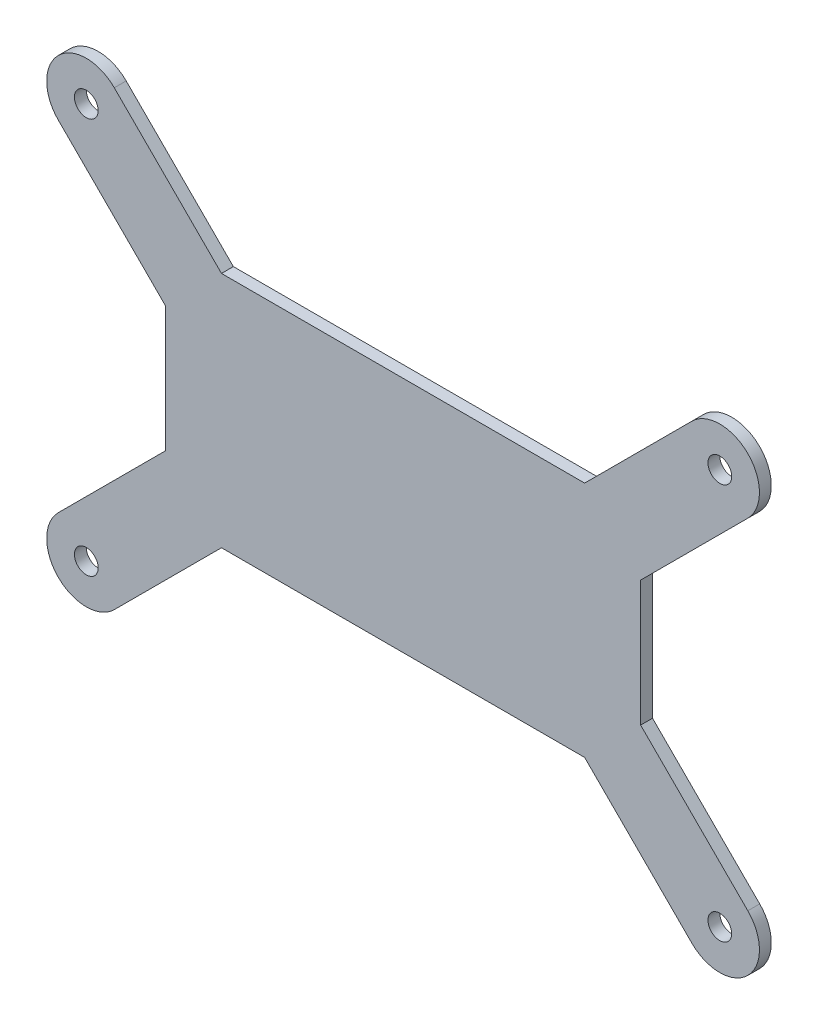
ISO-10303-21;
HEADER;
FILE_DESCRIPTION(('STEP AP214'),'2;1');
FILE_NAME('part.step','',(''),(''),'','','');
FILE_SCHEMA(('AUTOMOTIVE_DESIGN { 1 0 10303 214 1 1 1 1 }'));
ENDSEC;
DATA;
#1=APPLICATION_CONTEXT('core data for automotive mechanical design processes');
#2=APPLICATION_PROTOCOL_DEFINITION('international standard','automotive_design',2000,#1);
#3=PRODUCT_CONTEXT('',#1,'mechanical');
#4=PRODUCT('Part','Part','',(#3));
#5=PRODUCT_RELATED_PRODUCT_CATEGORY('part','',(#4));
#6=PRODUCT_DEFINITION_FORMATION('','',#4);
#7=PRODUCT_DEFINITION_CONTEXT('part definition',#1,'design');
#8=PRODUCT_DEFINITION('design','',#6,#7);
#9=PRODUCT_DEFINITION_SHAPE('','',#8);
#10=(LENGTH_UNIT() NAMED_UNIT(*) SI_UNIT(.MILLI.,.METRE.));
#11=(NAMED_UNIT(*) PLANE_ANGLE_UNIT() SI_UNIT($,.RADIAN.));
#12=(NAMED_UNIT(*) SI_UNIT($,.STERADIAN.) SOLID_ANGLE_UNIT());
#13=UNCERTAINTY_MEASURE_WITH_UNIT(LENGTH_MEASURE(1.E-05),#10,'distance_accuracy_value','');
#14=(GEOMETRIC_REPRESENTATION_CONTEXT(3) GLOBAL_UNCERTAINTY_ASSIGNED_CONTEXT((#13)) GLOBAL_UNIT_ASSIGNED_CONTEXT((#10,
#11,#12)) REPRESENTATION_CONTEXT('',''));
#15=CARTESIAN_POINT('',(0.,0.,0.));
#16=DIRECTION('',(0.,0.,1.));
#17=DIRECTION('',(1.,0.,0.));
#18=AXIS2_PLACEMENT_3D('',#15,#16,#17);
#19=CARTESIAN_POINT('',(-40.,-25.,1.5));
#20=DIRECTION('',(0.,0.,1.));
#21=DIRECTION('',(1.,0.,0.));
#22=AXIS2_PLACEMENT_3D('',#19,#20,#21);
#23=PLANE('',#22);
#24=CARTESIAN_POINT('',(40.,-25.,1.5));
#25=DIRECTION('',(0.,0.,1.));
#26=DIRECTION('',(1.,0.,0.));
#27=AXIS2_PLACEMENT_3D('',#24,#25,#26);
#28=CIRCLE('',#27,1.5);
#29=CARTESIAN_POINT('',(41.5,-25.,1.5));
#30=VERTEX_POINT('',#29);
#31=EDGE_CURVE('E401',#30,#30,#28,.T.);
#32=ORIENTED_EDGE('',*,*,#31,.F.);
#33=EDGE_LOOP('',(#32));
#34=FACE_BOUND('',#33,.T.);
#35=CARTESIAN_POINT('',(-40.,25.,1.5));
#36=DIRECTION('',(0.,0.,1.));
#37=DIRECTION('',(1.,0.,0.));
#38=AXIS2_PLACEMENT_3D('',#35,#36,#37);
#39=CIRCLE('',#38,1.5);
#40=CARTESIAN_POINT('',(-38.5,25.,1.5));
#41=VERTEX_POINT('',#40);
#42=EDGE_CURVE('E199',#41,#41,#39,.T.);
#43=ORIENTED_EDGE('',*,*,#42,.F.);
#44=EDGE_LOOP('',(#43));
#45=FACE_BOUND('',#44,.T.);
#46=CARTESIAN_POINT('',(-40.,-25.,1.5));
#47=DIRECTION('',(0.,0.,1.));
#48=DIRECTION('',(1.,0.,0.));
#49=AXIS2_PLACEMENT_3D('',#46,#47,#48);
#50=CIRCLE('',#49,4.99999999999999);
#51=CARTESIAN_POINT('',(-43.5355339059327,-21.4644660940673,1.5));
#52=VERTEX_POINT('',#51);
#53=CARTESIAN_POINT('',(-36.4644660940673,-28.5355339059327,1.5));
#54=VERTEX_POINT('',#53);
#55=EDGE_CURVE('E241',#52,#54,#50,.T.);
#56=ORIENTED_EDGE('',*,*,#55,.T.);
#57=DIRECTION('',(0.707106781186546,0.707106781186549,0.));
#58=VECTOR('',#57,1.);
#59=CARTESIAN_POINT('',(-36.4644660940673,-28.5355339059327,1.5));
#60=LINE('',#59,#58);
#61=CARTESIAN_POINT('',(-22.9289336208967,-15.0000014327621,1.5));
#62=VERTEX_POINT('',#61);
#63=EDGE_CURVE('E129',#54,#62,#60,.T.);
#64=ORIENTED_EDGE('',*,*,#63,.T.);
#65=DIRECTION('',(1.,0.,0.));
#66=VECTOR('',#65,1.);
#67=CARTESIAN_POINT('',(-22.9289336208967,-15.0000014327621,1.5));
#68=LINE('',#67,#66);
#69=CARTESIAN_POINT('',(22.9289336208967,-15.0000014327621,1.5));
#70=VERTEX_POINT('',#69);
#71=EDGE_CURVE('E294',#62,#70,#68,.T.);
#72=ORIENTED_EDGE('',*,*,#71,.T.);
#73=DIRECTION('',(0.707106781186546,-0.707106781186549,0.));
#74=VECTOR('',#73,1.);
#75=CARTESIAN_POINT('',(36.4644660940673,-28.5355339059327,1.5));
#76=LINE('',#75,#74);
#77=CARTESIAN_POINT('',(36.4644660940673,-28.5355339059327,1.5));
#78=VERTEX_POINT('',#77);
#79=EDGE_CURVE('E314',#70,#78,#76,.T.);
#80=ORIENTED_EDGE('',*,*,#79,.T.);
#81=CARTESIAN_POINT('',(40.,-25.,1.5));
#82=DIRECTION('',(0.,0.,1.));
#83=DIRECTION('',(1.,0.,0.));
#84=AXIS2_PLACEMENT_3D('',#81,#82,#83);
#85=CIRCLE('',#84,4.99999999999999);
#86=CARTESIAN_POINT('',(43.5355339059327,-21.4644660940673,1.5));
#87=VERTEX_POINT('',#86);
#88=EDGE_CURVE('E310',#78,#87,#85,.T.);
#89=ORIENTED_EDGE('',*,*,#88,.T.);
#90=DIRECTION('',(-0.707106781186546,0.707106781186549,0.));
#91=VECTOR('',#90,1.);
#92=CARTESIAN_POINT('',(43.5355339059327,-21.4644660940673,1.5));
#93=LINE('',#92,#91);
#94=CARTESIAN_POINT('',(30.,-7.92893218813448,1.5));
#95=VERTEX_POINT('',#94);
#96=EDGE_CURVE('E313',#87,#95,#93,.T.);
#97=ORIENTED_EDGE('',*,*,#96,.T.);
#98=DIRECTION('',(0.,1.,0.));
#99=VECTOR('',#98,1.);
#100=CARTESIAN_POINT('',(30.,7.92893218813448,1.5));
#101=LINE('',#100,#99);
#102=CARTESIAN_POINT('',(30.,7.92893218813448,1.5));
#103=VERTEX_POINT('',#102);
#104=EDGE_CURVE('E318',#95,#103,#101,.T.);
#105=ORIENTED_EDGE('',*,*,#104,.T.);
#106=DIRECTION('',(0.707106781186546,0.707106781186549,0.));
#107=VECTOR('',#106,1.);
#108=CARTESIAN_POINT('',(43.5355339059327,21.4644660940673,1.5));
#109=LINE('',#108,#107);
#110=CARTESIAN_POINT('',(43.5355339059327,21.4644660940673,1.5));
#111=VERTEX_POINT('',#110);
#112=EDGE_CURVE('E325',#103,#111,#109,.T.);
#113=ORIENTED_EDGE('',*,*,#112,.T.);
#114=CARTESIAN_POINT('',(40.,25.,1.5));
#115=DIRECTION('',(0.,0.,1.));
#116=DIRECTION('',(1.,0.,0.));
#117=AXIS2_PLACEMENT_3D('',#114,#115,#116);
#118=CIRCLE('',#117,4.99999999999999);
#119=CARTESIAN_POINT('',(36.4644660940673,28.5355339059327,1.5));
#120=VERTEX_POINT('',#119);
#121=EDGE_CURVE('E328',#111,#120,#118,.T.);
#122=ORIENTED_EDGE('',*,*,#121,.T.);
#123=DIRECTION('',(-0.707106781186547,-0.707106781186549,0.));
#124=VECTOR('',#123,1.);
#125=CARTESIAN_POINT('',(36.4644660940673,28.5355339059327,1.5));
#126=LINE('',#125,#124);
#127=CARTESIAN_POINT('',(22.9289336208967,15.0000014327621,1.5));
#128=VERTEX_POINT('',#127);
#129=EDGE_CURVE('E331',#120,#128,#126,.T.);
#130=ORIENTED_EDGE('',*,*,#129,.T.);
#131=DIRECTION('',(-1.,0.,0.));
#132=VECTOR('',#131,1.);
#133=CARTESIAN_POINT('',(-22.9289336208967,15.0000014327621,1.5));
#134=LINE('',#133,#132);
#135=CARTESIAN_POINT('',(-22.9289336208967,15.0000014327621,1.5));
#136=VERTEX_POINT('',#135);
#137=EDGE_CURVE('E334',#128,#136,#134,.T.);
#138=ORIENTED_EDGE('',*,*,#137,.T.);
#139=DIRECTION('',(-0.707106781186547,0.707106781186549,0.));
#140=VECTOR('',#139,1.);
#141=CARTESIAN_POINT('',(-36.4644660940673,28.5355339059327,1.5));
#142=LINE('',#141,#140);
#143=CARTESIAN_POINT('',(-36.4644660940673,28.5355339059327,1.5));
#144=VERTEX_POINT('',#143);
#145=EDGE_CURVE('E337',#136,#144,#142,.T.);
#146=ORIENTED_EDGE('',*,*,#145,.T.);
#147=CARTESIAN_POINT('',(-40.,25.,1.5));
#148=DIRECTION('',(0.,0.,1.));
#149=DIRECTION('',(1.,0.,0.));
#150=AXIS2_PLACEMENT_3D('',#147,#148,#149);
#151=CIRCLE('',#150,4.99999999999999);
#152=CARTESIAN_POINT('',(-43.5355339059327,21.4644660940673,1.5));
#153=VERTEX_POINT('',#152);
#154=EDGE_CURVE('E172',#144,#153,#151,.T.);
#155=ORIENTED_EDGE('',*,*,#154,.T.);
#156=DIRECTION('',(0.707106781186546,-0.707106781186549,0.));
#157=VECTOR('',#156,1.);
#158=CARTESIAN_POINT('',(-43.5355339059327,21.4644660940673,1.5));
#159=LINE('',#158,#157);
#160=CARTESIAN_POINT('',(-30.,7.92893218813448,1.5));
#161=VERTEX_POINT('',#160);
#162=EDGE_CURVE('E166',#153,#161,#159,.T.);
#163=ORIENTED_EDGE('',*,*,#162,.T.);
#164=DIRECTION('',(0.,-1.,0.));
#165=VECTOR('',#164,1.);
#166=CARTESIAN_POINT('',(-30.,7.92893218813448,1.5));
#167=LINE('',#166,#165);
#168=CARTESIAN_POINT('',(-30.,-7.92893218813448,1.5));
#169=VERTEX_POINT('',#168);
#170=EDGE_CURVE('E170',#161,#169,#167,.T.);
#171=ORIENTED_EDGE('',*,*,#170,.T.);
#172=DIRECTION('',(-0.707106781186546,-0.707106781186549,0.));
#173=VECTOR('',#172,1.);
#174=CARTESIAN_POINT('',(-43.5355339059327,-21.4644660940673,1.5));
#175=LINE('',#174,#173);
#176=EDGE_CURVE('E62',#169,#52,#175,.T.);
#177=ORIENTED_EDGE('',*,*,#176,.T.);
#178=EDGE_LOOP('',(#56,#64,#72,#80,#89,#97,#105,#113,#122,#130,#138,#146,#155,#163,#171,#177));
#179=FACE_BOUND('',#178,.T.);
#180=CARTESIAN_POINT('',(40.,25.,1.5));
#181=DIRECTION('',(0.,0.,1.));
#182=DIRECTION('',(1.,0.,0.));
#183=AXIS2_PLACEMENT_3D('',#180,#181,#182);
#184=CIRCLE('',#183,1.5);
#185=CARTESIAN_POINT('',(41.5,25.,1.5));
#186=VERTEX_POINT('',#185);
#187=EDGE_CURVE('E409',#186,#186,#184,.T.);
#188=ORIENTED_EDGE('',*,*,#187,.F.);
#189=EDGE_LOOP('',(#188));
#190=FACE_BOUND('',#189,.T.);
#191=CARTESIAN_POINT('',(-40.,-25.,1.5));
#192=DIRECTION('',(0.,0.,1.));
#193=DIRECTION('',(1.,0.,0.));
#194=AXIS2_PLACEMENT_3D('',#191,#192,#193);
#195=CIRCLE('',#194,1.5);
#196=CARTESIAN_POINT('',(-38.5,-25.,1.5));
#197=VERTEX_POINT('',#196);
#198=EDGE_CURVE('E390',#197,#197,#195,.T.);
#199=ORIENTED_EDGE('',*,*,#198,.F.);
#200=EDGE_LOOP('',(#199));
#201=FACE_BOUND('',#200,.T.);
#202=ADVANCED_FACE('F44',(#34,#45,#179,#190,#201),#23,.T.);
#203=CARTESIAN_POINT('',(-40.,-25.,0.));
#204=DIRECTION('',(0.,0.,1.));
#205=DIRECTION('',(1.,0.,0.));
#206=AXIS2_PLACEMENT_3D('',#203,#204,#205);
#207=PLANE('',#206);
#208=CARTESIAN_POINT('',(-40.,-25.,0.));
#209=DIRECTION('',(0.,0.,1.));
#210=DIRECTION('',(1.,0.,0.));
#211=AXIS2_PLACEMENT_3D('',#208,#209,#210);
#212=CIRCLE('',#211,4.99999999999999);
#213=CARTESIAN_POINT('',(-43.5355339059327,-21.4644660940673,0.));
#214=VERTEX_POINT('',#213);
#215=CARTESIAN_POINT('',(-36.4644660940673,-28.5355339059327,0.));
#216=VERTEX_POINT('',#215);
#217=EDGE_CURVE('E194',#214,#216,#212,.T.);
#218=ORIENTED_EDGE('',*,*,#217,.F.);
#219=DIRECTION('',(-0.707106781186546,-0.707106781186549,0.));
#220=VECTOR('',#219,1.);
#221=CARTESIAN_POINT('',(-43.5355339059327,-21.4644660940673,0.));
#222=LINE('',#221,#220);
#223=CARTESIAN_POINT('',(-30.,-7.92893218813448,0.));
#224=VERTEX_POINT('',#223);
#225=EDGE_CURVE('E121',#224,#214,#222,.T.);
#226=ORIENTED_EDGE('',*,*,#225,.F.);
#227=DIRECTION('',(0.,-1.,0.));
#228=VECTOR('',#227,1.);
#229=CARTESIAN_POINT('',(-30.,7.92893218813448,0.));
#230=LINE('',#229,#228);
#231=CARTESIAN_POINT('',(-30.,7.92893218813448,0.));
#232=VERTEX_POINT('',#231);
#233=EDGE_CURVE('E115',#232,#224,#230,.T.);
#234=ORIENTED_EDGE('',*,*,#233,.F.);
#235=DIRECTION('',(0.707106781186546,-0.707106781186549,0.));
#236=VECTOR('',#235,1.);
#237=CARTESIAN_POINT('',(-43.5355339059327,21.4644660940673,0.));
#238=LINE('',#237,#236);
#239=CARTESIAN_POINT('',(-43.5355339059327,21.4644660940673,0.));
#240=VERTEX_POINT('',#239);
#241=EDGE_CURVE('E181',#240,#232,#238,.T.);
#242=ORIENTED_EDGE('',*,*,#241,.F.);
#243=CARTESIAN_POINT('',(-40.,25.,0.));
#244=DIRECTION('',(0.,0.,1.));
#245=DIRECTION('',(1.,0.,0.));
#246=AXIS2_PLACEMENT_3D('',#243,#244,#245);
#247=CIRCLE('',#246,4.99999999999999);
#248=CARTESIAN_POINT('',(-36.4644660940673,28.5355339059327,0.));
#249=VERTEX_POINT('',#248);
#250=EDGE_CURVE('E232',#249,#240,#247,.T.);
#251=ORIENTED_EDGE('',*,*,#250,.F.);
#252=DIRECTION('',(-0.707106781186547,0.707106781186549,0.));
#253=VECTOR('',#252,1.);
#254=CARTESIAN_POINT('',(-36.4644660940673,28.5355339059327,0.));
#255=LINE('',#254,#253);
#256=CARTESIAN_POINT('',(-22.9289336208967,15.0000014327621,0.));
#257=VERTEX_POINT('',#256);
#258=EDGE_CURVE('E229',#257,#249,#255,.T.);
#259=ORIENTED_EDGE('',*,*,#258,.F.);
#260=DIRECTION('',(-1.,0.,0.));
#261=VECTOR('',#260,1.);
#262=CARTESIAN_POINT('',(-22.9289336208967,15.0000014327621,0.));
#263=LINE('',#262,#261);
#264=CARTESIAN_POINT('',(22.9289336208967,15.0000014327621,0.));
#265=VERTEX_POINT('',#264);
#266=EDGE_CURVE('E226',#265,#257,#263,.T.);
#267=ORIENTED_EDGE('',*,*,#266,.F.);
#268=DIRECTION('',(-0.707106781186547,-0.707106781186549,0.));
#269=VECTOR('',#268,1.);
#270=CARTESIAN_POINT('',(36.4644660940673,28.5355339059327,0.));
#271=LINE('',#270,#269);
#272=CARTESIAN_POINT('',(36.4644660940673,28.5355339059327,0.));
#273=VERTEX_POINT('',#272);
#274=EDGE_CURVE('E223',#273,#265,#271,.T.);
#275=ORIENTED_EDGE('',*,*,#274,.F.);
#276=CARTESIAN_POINT('',(40.,25.,0.));
#277=DIRECTION('',(0.,0.,1.));
#278=DIRECTION('',(1.,0.,0.));
#279=AXIS2_PLACEMENT_3D('',#276,#277,#278);
#280=CIRCLE('',#279,4.99999999999999);
#281=CARTESIAN_POINT('',(43.5355339059327,21.4644660940673,0.));
#282=VERTEX_POINT('',#281);
#283=EDGE_CURVE('E220',#282,#273,#280,.T.);
#284=ORIENTED_EDGE('',*,*,#283,.F.);
#285=DIRECTION('',(0.707106781186546,0.707106781186549,0.));
#286=VECTOR('',#285,1.);
#287=CARTESIAN_POINT('',(43.5355339059327,21.4644660940673,0.));
#288=LINE('',#287,#286);
#289=CARTESIAN_POINT('',(30.,7.92893218813448,0.));
#290=VERTEX_POINT('',#289);
#291=EDGE_CURVE('E217',#290,#282,#288,.T.);
#292=ORIENTED_EDGE('',*,*,#291,.F.);
#293=DIRECTION('',(0.,1.,0.));
#294=VECTOR('',#293,1.);
#295=CARTESIAN_POINT('',(30.,7.92893218813448,0.));
#296=LINE('',#295,#294);
#297=CARTESIAN_POINT('',(30.,-7.92893218813448,0.));
#298=VERTEX_POINT('',#297);
#299=EDGE_CURVE('E214',#298,#290,#296,.T.);
#300=ORIENTED_EDGE('',*,*,#299,.F.);
#301=DIRECTION('',(-0.707106781186546,0.707106781186549,0.));
#302=VECTOR('',#301,1.);
#303=CARTESIAN_POINT('',(43.5355339059327,-21.4644660940673,0.));
#304=LINE('',#303,#302);
#305=CARTESIAN_POINT('',(43.5355339059327,-21.4644660940673,0.));
#306=VERTEX_POINT('',#305);
#307=EDGE_CURVE('E211',#306,#298,#304,.T.);
#308=ORIENTED_EDGE('',*,*,#307,.F.);
#309=CARTESIAN_POINT('',(40.,-25.,0.));
#310=DIRECTION('',(0.,0.,1.));
#311=DIRECTION('',(1.,0.,0.));
#312=AXIS2_PLACEMENT_3D('',#309,#310,#311);
#313=CIRCLE('',#312,4.99999999999999);
#314=CARTESIAN_POINT('',(36.4644660940673,-28.5355339059327,0.));
#315=VERTEX_POINT('',#314);
#316=EDGE_CURVE('E208',#315,#306,#313,.T.);
#317=ORIENTED_EDGE('',*,*,#316,.F.);
#318=DIRECTION('',(0.707106781186546,-0.707106781186549,0.));
#319=VECTOR('',#318,1.);
#320=CARTESIAN_POINT('',(36.4644660940673,-28.5355339059327,0.));
#321=LINE('',#320,#319);
#322=CARTESIAN_POINT('',(22.9289336208967,-15.0000014327621,0.));
#323=VERTEX_POINT('',#322);
#324=EDGE_CURVE('E205',#323,#315,#321,.T.);
#325=ORIENTED_EDGE('',*,*,#324,.F.);
#326=DIRECTION('',(1.,0.,0.));
#327=VECTOR('',#326,1.);
#328=CARTESIAN_POINT('',(-22.9289336208967,-15.0000014327621,0.));
#329=LINE('',#328,#327);
#330=CARTESIAN_POINT('',(-22.9289336208967,-15.0000014327621,0.));
#331=VERTEX_POINT('',#330);
#332=EDGE_CURVE('E202',#331,#323,#329,.T.);
#333=ORIENTED_EDGE('',*,*,#332,.F.);
#334=DIRECTION('',(0.707106781186546,0.707106781186549,0.));
#335=VECTOR('',#334,1.);
#336=CARTESIAN_POINT('',(-36.4644660940673,-28.5355339059327,0.));
#337=LINE('',#336,#335);
#338=EDGE_CURVE('E198',#216,#331,#337,.T.);
#339=ORIENTED_EDGE('',*,*,#338,.F.);
#340=EDGE_LOOP('',(#218,#226,#234,#242,#251,#259,#267,#275,#284,#292,#300,#308,#317,#325,#333,#339));
#341=FACE_BOUND('',#340,.T.);
#342=CARTESIAN_POINT('',(-40.,25.,0.));
#343=DIRECTION('',(0.,0.,1.));
#344=DIRECTION('',(1.,0.,0.));
#345=AXIS2_PLACEMENT_3D('',#342,#343,#344);
#346=CIRCLE('',#345,1.5);
#347=CARTESIAN_POINT('',(-38.5,25.,0.));
#348=VERTEX_POINT('',#347);
#349=EDGE_CURVE('E413',#348,#348,#346,.T.);
#350=ORIENTED_EDGE('',*,*,#349,.T.);
#351=EDGE_LOOP('',(#350));
#352=FACE_BOUND('',#351,.T.);
#353=CARTESIAN_POINT('',(40.,25.,0.));
#354=DIRECTION('',(0.,0.,1.));
#355=DIRECTION('',(1.,0.,0.));
#356=AXIS2_PLACEMENT_3D('',#353,#354,#355);
#357=CIRCLE('',#356,1.5);
#358=CARTESIAN_POINT('',(41.5,25.,0.));
#359=VERTEX_POINT('',#358);
#360=EDGE_CURVE('E405',#359,#359,#357,.T.);
#361=ORIENTED_EDGE('',*,*,#360,.T.);
#362=EDGE_LOOP('',(#361));
#363=FACE_BOUND('',#362,.T.);
#364=CARTESIAN_POINT('',(40.,-25.,0.));
#365=DIRECTION('',(0.,0.,1.));
#366=DIRECTION('',(1.,0.,0.));
#367=AXIS2_PLACEMENT_3D('',#364,#365,#366);
#368=CIRCLE('',#367,1.5);
#369=CARTESIAN_POINT('',(41.5,-25.,0.));
#370=VERTEX_POINT('',#369);
#371=EDGE_CURVE('E398',#370,#370,#368,.T.);
#372=ORIENTED_EDGE('',*,*,#371,.T.);
#373=EDGE_LOOP('',(#372));
#374=FACE_BOUND('',#373,.T.);
#375=CARTESIAN_POINT('',(-40.,-25.,0.));
#376=DIRECTION('',(0.,0.,1.));
#377=DIRECTION('',(1.,0.,0.));
#378=AXIS2_PLACEMENT_3D('',#375,#376,#377);
#379=CIRCLE('',#378,1.5);
#380=CARTESIAN_POINT('',(-38.5,-25.,0.));
#381=VERTEX_POINT('',#380);
#382=EDGE_CURVE('E393',#381,#381,#379,.T.);
#383=ORIENTED_EDGE('',*,*,#382,.T.);
#384=EDGE_LOOP('',(#383));
#385=FACE_BOUND('',#384,.T.);
#386=ADVANCED_FACE('F298',(#341,#352,#363,#374,#385),#207,.F.);
#387=CARTESIAN_POINT('',(-40.,-25.,1.5));
#388=DIRECTION('',(0.,0.,-1.));
#389=DIRECTION('',(-1.,0.,0.));
#390=AXIS2_PLACEMENT_3D('',#387,#388,#389);
#391=CYLINDRICAL_SURFACE('',#390,4.99999999999999);
#392=ORIENTED_EDGE('',*,*,#217,.T.);
#393=DIRECTION('',(0.,0.,-1.));
#394=VECTOR('',#393,1.);
#395=CARTESIAN_POINT('',(-36.4644660940673,-28.5355339059327,1.5));
#396=LINE('',#395,#394);
#397=EDGE_CURVE('E11',#54,#216,#396,.T.);
#398=ORIENTED_EDGE('',*,*,#397,.F.);
#399=ORIENTED_EDGE('',*,*,#55,.F.);
#400=DIRECTION('',(0.,0.,-1.));
#401=VECTOR('',#400,1.);
#402=CARTESIAN_POINT('',(-43.5355339059327,-21.4644660940673,1.5));
#403=LINE('',#402,#401);
#404=EDGE_CURVE('E190',#52,#214,#403,.T.);
#405=ORIENTED_EDGE('',*,*,#404,.T.);
#406=EDGE_LOOP('',(#392,#398,#399,#405));
#407=FACE_BOUND('',#406,.T.);
#408=ADVANCED_FACE('F46',(#407),#391,.T.);
#409=CARTESIAN_POINT('',(-36.4644660940673,-28.5355339059327,1.5));
#410=DIRECTION('',(-0.707106781186549,0.707106781186546,0.));
#411=DIRECTION('',(-0.707106781186546,-0.707106781186549,0.));
#412=AXIS2_PLACEMENT_3D('',#409,#410,#411);
#413=PLANE('',#412);
#414=ORIENTED_EDGE('',*,*,#338,.T.);
#415=DIRECTION('',(0.,0.,-1.));
#416=VECTOR('',#415,1.);
#417=CARTESIAN_POINT('',(-22.9289336208967,-15.0000014327621,1.5));
#418=LINE('',#417,#416);
#419=EDGE_CURVE('E54',#62,#331,#418,.T.);
#420=ORIENTED_EDGE('',*,*,#419,.F.);
#421=ORIENTED_EDGE('',*,*,#63,.F.);
#422=ORIENTED_EDGE('',*,*,#397,.T.);
#423=EDGE_LOOP('',(#414,#420,#421,#422));
#424=FACE_BOUND('',#423,.T.);
#425=ADVANCED_FACE('F551',(#424),#413,.F.);
#426=CARTESIAN_POINT('',(-22.9289336208967,-15.0000014327621,1.5));
#427=DIRECTION('',(0.,1.,0.));
#428=DIRECTION('',(0.,0.,1.));
#429=AXIS2_PLACEMENT_3D('',#426,#427,#428);
#430=PLANE('',#429);
#431=ORIENTED_EDGE('',*,*,#332,.T.);
#432=DIRECTION('',(0.,0.,-1.));
#433=VECTOR('',#432,1.);
#434=CARTESIAN_POINT('',(22.9289336208967,-15.0000014327621,1.5));
#435=LINE('',#434,#433);
#436=EDGE_CURVE('E284',#70,#323,#435,.T.);
#437=ORIENTED_EDGE('',*,*,#436,.F.);
#438=ORIENTED_EDGE('',*,*,#71,.F.);
#439=ORIENTED_EDGE('',*,*,#419,.T.);
#440=EDGE_LOOP('',(#431,#437,#438,#439));
#441=FACE_BOUND('',#440,.T.);
#442=ADVANCED_FACE('F292',(#441),#430,.F.);
#443=CARTESIAN_POINT('',(36.4644660940673,-28.5355339059327,1.5));
#444=DIRECTION('',(0.707106781186549,0.707106781186546,0.));
#445=DIRECTION('',(-0.707106781186546,0.707106781186549,0.));
#446=AXIS2_PLACEMENT_3D('',#443,#444,#445);
#447=PLANE('',#446);
#448=ORIENTED_EDGE('',*,*,#324,.T.);
#449=DIRECTION('',(0.,0.,-1.));
#450=VECTOR('',#449,1.);
#451=CARTESIAN_POINT('',(36.4644660940673,-28.5355339059327,1.5));
#452=LINE('',#451,#450);
#453=EDGE_CURVE('E280',#78,#315,#452,.T.);
#454=ORIENTED_EDGE('',*,*,#453,.F.);
#455=ORIENTED_EDGE('',*,*,#79,.F.);
#456=ORIENTED_EDGE('',*,*,#436,.T.);
#457=EDGE_LOOP('',(#448,#454,#455,#456));
#458=FACE_BOUND('',#457,.T.);
#459=ADVANCED_FACE('F304',(#458),#447,.F.);
#460=CARTESIAN_POINT('',(40.,-25.,1.5));
#461=DIRECTION('',(0.,0.,-1.));
#462=DIRECTION('',(-1.,0.,0.));
#463=AXIS2_PLACEMENT_3D('',#460,#461,#462);
#464=CYLINDRICAL_SURFACE('',#463,4.99999999999999);
#465=ORIENTED_EDGE('',*,*,#316,.T.);
#466=DIRECTION('',(0.,0.,-1.));
#467=VECTOR('',#466,1.);
#468=CARTESIAN_POINT('',(43.5355339059327,-21.4644660940673,1.5));
#469=LINE('',#468,#467);
#470=EDGE_CURVE('E276',#87,#306,#469,.T.);
#471=ORIENTED_EDGE('',*,*,#470,.F.);
#472=ORIENTED_EDGE('',*,*,#88,.F.);
#473=ORIENTED_EDGE('',*,*,#453,.T.);
#474=EDGE_LOOP('',(#465,#471,#472,#473));
#475=FACE_BOUND('',#474,.T.);
#476=ADVANCED_FACE('F308',(#475),#464,.T.);
#477=CARTESIAN_POINT('',(43.5355339059327,-21.4644660940673,1.5));
#478=DIRECTION('',(-0.707106781186549,-0.707106781186546,0.));
#479=DIRECTION('',(0.707106781186546,-0.707106781186549,0.));
#480=AXIS2_PLACEMENT_3D('',#477,#478,#479);
#481=PLANE('',#480);
#482=ORIENTED_EDGE('',*,*,#307,.T.);
#483=DIRECTION('',(0.,0.,-1.));
#484=VECTOR('',#483,1.);
#485=CARTESIAN_POINT('',(30.,-7.92893218813448,1.5));
#486=LINE('',#485,#484);
#487=EDGE_CURVE('E272',#95,#298,#486,.T.);
#488=ORIENTED_EDGE('',*,*,#487,.F.);
#489=ORIENTED_EDGE('',*,*,#96,.F.);
#490=ORIENTED_EDGE('',*,*,#470,.T.);
#491=EDGE_LOOP('',(#482,#488,#489,#490));
#492=FACE_BOUND('',#491,.T.);
#493=ADVANCED_FACE('F520',(#492),#481,.F.);
#494=CARTESIAN_POINT('',(30.,7.92893218813448,1.5));
#495=DIRECTION('',(-1.,0.,0.));
#496=DIRECTION('',(0.,-1.,0.));
#497=AXIS2_PLACEMENT_3D('',#494,#495,#496);
#498=PLANE('',#497);
#499=ORIENTED_EDGE('',*,*,#299,.T.);
#500=DIRECTION('',(0.,0.,-1.));
#501=VECTOR('',#500,1.);
#502=CARTESIAN_POINT('',(30.,7.92893218813448,1.5));
#503=LINE('',#502,#501);
#504=EDGE_CURVE('E268',#103,#290,#503,.T.);
#505=ORIENTED_EDGE('',*,*,#504,.F.);
#506=ORIENTED_EDGE('',*,*,#104,.F.);
#507=ORIENTED_EDGE('',*,*,#487,.T.);
#508=EDGE_LOOP('',(#499,#505,#506,#507));
#509=FACE_BOUND('',#508,.T.);
#510=ADVANCED_FACE('F511',(#509),#498,.F.);
#511=CARTESIAN_POINT('',(43.5355339059327,21.4644660940673,1.5));
#512=DIRECTION('',(-0.707106781186549,0.707106781186546,0.));
#513=DIRECTION('',(-0.707106781186546,-0.707106781186549,0.));
#514=AXIS2_PLACEMENT_3D('',#511,#512,#513);
#515=PLANE('',#514);
#516=ORIENTED_EDGE('',*,*,#291,.T.);
#517=DIRECTION('',(0.,0.,-1.));
#518=VECTOR('',#517,1.);
#519=CARTESIAN_POINT('',(43.5355339059327,21.4644660940673,1.5));
#520=LINE('',#519,#518);
#521=EDGE_CURVE('E264',#111,#282,#520,.T.);
#522=ORIENTED_EDGE('',*,*,#521,.F.);
#523=ORIENTED_EDGE('',*,*,#112,.F.);
#524=ORIENTED_EDGE('',*,*,#504,.T.);
#525=EDGE_LOOP('',(#516,#522,#523,#524));
#526=FACE_BOUND('',#525,.T.);
#527=ADVANCED_FACE('F502',(#526),#515,.F.);
#528=CARTESIAN_POINT('',(40.,25.,1.5));
#529=DIRECTION('',(0.,0.,-1.));
#530=DIRECTION('',(-1.,0.,0.));
#531=AXIS2_PLACEMENT_3D('',#528,#529,#530);
#532=CYLINDRICAL_SURFACE('',#531,4.99999999999999);
#533=ORIENTED_EDGE('',*,*,#283,.T.);
#534=DIRECTION('',(0.,0.,-1.));
#535=VECTOR('',#534,1.);
#536=CARTESIAN_POINT('',(36.4644660940673,28.5355339059327,1.5));
#537=LINE('',#536,#535);
#538=EDGE_CURVE('E260',#120,#273,#537,.T.);
#539=ORIENTED_EDGE('',*,*,#538,.F.);
#540=ORIENTED_EDGE('',*,*,#121,.F.);
#541=ORIENTED_EDGE('',*,*,#521,.T.);
#542=EDGE_LOOP('',(#533,#539,#540,#541));
#543=FACE_BOUND('',#542,.T.);
#544=ADVANCED_FACE('F493',(#543),#532,.T.);
#545=CARTESIAN_POINT('',(36.4644660940673,28.5355339059327,1.5));
#546=DIRECTION('',(0.707106781186548,-0.707106781186546,0.));
#547=DIRECTION('',(0.707106781186547,0.707106781186549,0.));
#548=AXIS2_PLACEMENT_3D('',#545,#546,#547);
#549=PLANE('',#548);
#550=ORIENTED_EDGE('',*,*,#274,.T.);
#551=DIRECTION('',(0.,0.,-1.));
#552=VECTOR('',#551,1.);
#553=CARTESIAN_POINT('',(22.9289336208967,15.0000014327621,1.5));
#554=LINE('',#553,#552);
#555=EDGE_CURVE('E256',#128,#265,#554,.T.);
#556=ORIENTED_EDGE('',*,*,#555,.F.);
#557=ORIENTED_EDGE('',*,*,#129,.F.);
#558=ORIENTED_EDGE('',*,*,#538,.T.);
#559=EDGE_LOOP('',(#550,#556,#557,#558));
#560=FACE_BOUND('',#559,.T.);
#561=ADVANCED_FACE('F484',(#560),#549,.F.);
#562=CARTESIAN_POINT('',(-22.9289336208967,15.0000014327621,1.5));
#563=DIRECTION('',(0.,-1.,0.));
#564=DIRECTION('',(0.,0.,-1.));
#565=AXIS2_PLACEMENT_3D('',#562,#563,#564);
#566=PLANE('',#565);
#567=ORIENTED_EDGE('',*,*,#266,.T.);
#568=DIRECTION('',(0.,0.,-1.));
#569=VECTOR('',#568,1.);
#570=CARTESIAN_POINT('',(-22.9289336208967,15.0000014327621,1.5));
#571=LINE('',#570,#569);
#572=EDGE_CURVE('E252',#136,#257,#571,.T.);
#573=ORIENTED_EDGE('',*,*,#572,.F.);
#574=ORIENTED_EDGE('',*,*,#137,.F.);
#575=ORIENTED_EDGE('',*,*,#555,.T.);
#576=EDGE_LOOP('',(#567,#573,#574,#575));
#577=FACE_BOUND('',#576,.T.);
#578=ADVANCED_FACE('F476',(#577),#566,.F.);
#579=CARTESIAN_POINT('',(-36.4644660940673,28.5355339059327,1.5));
#580=DIRECTION('',(-0.707106781186548,-0.707106781186546,0.));
#581=DIRECTION('',(0.707106781186547,-0.707106781186549,0.));
#582=AXIS2_PLACEMENT_3D('',#579,#580,#581);
#583=PLANE('',#582);
#584=ORIENTED_EDGE('',*,*,#258,.T.);
#585=DIRECTION('',(0.,0.,-1.));
#586=VECTOR('',#585,1.);
#587=CARTESIAN_POINT('',(-36.4644660940673,28.5355339059327,1.5));
#588=LINE('',#587,#586);
#589=EDGE_CURVE('E248',#144,#249,#588,.T.);
#590=ORIENTED_EDGE('',*,*,#589,.F.);
#591=ORIENTED_EDGE('',*,*,#145,.F.);
#592=ORIENTED_EDGE('',*,*,#572,.T.);
#593=EDGE_LOOP('',(#584,#590,#591,#592));
#594=FACE_BOUND('',#593,.T.);
#595=ADVANCED_FACE('F345',(#594),#583,.F.);
#596=CARTESIAN_POINT('',(-40.,25.,1.5));
#597=DIRECTION('',(0.,0.,-1.));
#598=DIRECTION('',(-1.,0.,0.));
#599=AXIS2_PLACEMENT_3D('',#596,#597,#598);
#600=CYLINDRICAL_SURFACE('',#599,4.99999999999999);
#601=ORIENTED_EDGE('',*,*,#250,.T.);
#602=DIRECTION('',(0.,0.,-1.));
#603=VECTOR('',#602,1.);
#604=CARTESIAN_POINT('',(-43.5355339059327,21.4644660940673,1.5));
#605=LINE('',#604,#603);
#606=EDGE_CURVE('E183',#153,#240,#605,.T.);
#607=ORIENTED_EDGE('',*,*,#606,.F.);
#608=ORIENTED_EDGE('',*,*,#154,.F.);
#609=ORIENTED_EDGE('',*,*,#589,.T.);
#610=EDGE_LOOP('',(#601,#607,#608,#609));
#611=FACE_BOUND('',#610,.T.);
#612=ADVANCED_FACE('F349',(#611),#600,.T.);
#613=CARTESIAN_POINT('',(-43.5355339059327,21.4644660940673,1.5));
#614=DIRECTION('',(0.707106781186549,0.707106781186546,0.));
#615=DIRECTION('',(-0.707106781186546,0.707106781186549,0.));
#616=AXIS2_PLACEMENT_3D('',#613,#614,#615);
#617=PLANE('',#616);
#618=ORIENTED_EDGE('',*,*,#241,.T.);
#619=DIRECTION('',(0.,0.,-1.));
#620=VECTOR('',#619,1.);
#621=CARTESIAN_POINT('',(-30.,7.92893218813448,1.5));
#622=LINE('',#621,#620);
#623=EDGE_CURVE('E178',#161,#232,#622,.T.);
#624=ORIENTED_EDGE('',*,*,#623,.F.);
#625=ORIENTED_EDGE('',*,*,#162,.F.);
#626=ORIENTED_EDGE('',*,*,#606,.T.);
#627=EDGE_LOOP('',(#618,#624,#625,#626));
#628=FACE_BOUND('',#627,.T.);
#629=ADVANCED_FACE('F179',(#628),#617,.F.);
#630=CARTESIAN_POINT('',(-30.,7.92893218813448,1.5));
#631=DIRECTION('',(1.,0.,0.));
#632=DIRECTION('',(0.,1.,0.));
#633=AXIS2_PLACEMENT_3D('',#630,#631,#632);
#634=PLANE('',#633);
#635=ORIENTED_EDGE('',*,*,#233,.T.);
#636=DIRECTION('',(0.,0.,-1.));
#637=VECTOR('',#636,1.);
#638=CARTESIAN_POINT('',(-30.,-7.92893218813448,1.5));
#639=LINE('',#638,#637);
#640=EDGE_CURVE('E184',#169,#224,#639,.T.);
#641=ORIENTED_EDGE('',*,*,#640,.F.);
#642=ORIENTED_EDGE('',*,*,#170,.F.);
#643=ORIENTED_EDGE('',*,*,#623,.T.);
#644=EDGE_LOOP('',(#635,#641,#642,#643));
#645=FACE_BOUND('',#644,.T.);
#646=ADVANCED_FACE('F186',(#645),#634,.F.);
#647=CARTESIAN_POINT('',(-43.5355339059327,-21.4644660940673,1.5));
#648=DIRECTION('',(0.707106781186549,-0.707106781186546,0.));
#649=DIRECTION('',(0.707106781186546,0.707106781186549,0.));
#650=AXIS2_PLACEMENT_3D('',#647,#648,#649);
#651=PLANE('',#650);
#652=ORIENTED_EDGE('',*,*,#225,.T.);
#653=ORIENTED_EDGE('',*,*,#404,.F.);
#654=ORIENTED_EDGE('',*,*,#176,.F.);
#655=ORIENTED_EDGE('',*,*,#640,.T.);
#656=EDGE_LOOP('',(#652,#653,#654,#655));
#657=FACE_BOUND('',#656,.T.);
#658=ADVANCED_FACE('F353',(#657),#651,.F.);
#659=CARTESIAN_POINT('',(-40.,25.,1.5));
#660=DIRECTION('',(0.,0.,-1.));
#661=DIRECTION('',(-1.,0.,0.));
#662=AXIS2_PLACEMENT_3D('',#659,#660,#661);
#663=CYLINDRICAL_SURFACE('',#662,1.5);
#664=ORIENTED_EDGE('',*,*,#42,.T.);
#665=EDGE_LOOP('',(#664));
#666=FACE_BOUND('',#665,.T.);
#667=ORIENTED_EDGE('',*,*,#349,.F.);
#668=EDGE_LOOP('',(#667));
#669=FACE_BOUND('',#668,.T.);
#670=ADVANCED_FACE('F355',(#666,#669),#663,.F.);
#671=CARTESIAN_POINT('',(40.,25.,1.5));
#672=DIRECTION('',(0.,0.,-1.));
#673=DIRECTION('',(-1.,0.,0.));
#674=AXIS2_PLACEMENT_3D('',#671,#672,#673);
#675=CYLINDRICAL_SURFACE('',#674,1.5);
#676=ORIENTED_EDGE('',*,*,#187,.T.);
#677=EDGE_LOOP('',(#676));
#678=FACE_BOUND('',#677,.T.);
#679=ORIENTED_EDGE('',*,*,#360,.F.);
#680=EDGE_LOOP('',(#679));
#681=FACE_BOUND('',#680,.T.);
#682=ADVANCED_FACE('F361',(#678,#681),#675,.F.);
#683=CARTESIAN_POINT('',(40.,-25.,1.5));
#684=DIRECTION('',(0.,0.,-1.));
#685=DIRECTION('',(-1.,0.,0.));
#686=AXIS2_PLACEMENT_3D('',#683,#684,#685);
#687=CYLINDRICAL_SURFACE('',#686,1.5);
#688=ORIENTED_EDGE('',*,*,#31,.T.);
#689=EDGE_LOOP('',(#688));
#690=FACE_BOUND('',#689,.T.);
#691=ORIENTED_EDGE('',*,*,#371,.F.);
#692=EDGE_LOOP('',(#691));
#693=FACE_BOUND('',#692,.T.);
#694=ADVANCED_FACE('F377',(#690,#693),#687,.F.);
#695=CARTESIAN_POINT('',(-40.,-25.,1.5));
#696=DIRECTION('',(0.,0.,-1.));
#697=DIRECTION('',(-1.,0.,0.));
#698=AXIS2_PLACEMENT_3D('',#695,#696,#697);
#699=CYLINDRICAL_SURFACE('',#698,1.5);
#700=ORIENTED_EDGE('',*,*,#198,.T.);
#701=EDGE_LOOP('',(#700));
#702=FACE_BOUND('',#701,.T.);
#703=ORIENTED_EDGE('',*,*,#382,.F.);
#704=EDGE_LOOP('',(#703));
#705=FACE_BOUND('',#704,.T.);
#706=ADVANCED_FACE('F381',(#702,#705),#699,.F.);
#707=CLOSED_SHELL('',(#202,#386,#408,#425,#442,#459,#476,#493,#510,#527,#544,#561,#578,#595,
#612,#629,#646,#658,#670,#682,#694,#706));
#708=MANIFOLD_SOLID_BREP('B2',#707);
#709=ADVANCED_BREP_SHAPE_REPRESENTATION('',(#18,#708),#14);
#710=SHAPE_DEFINITION_REPRESENTATION(#9,#709);
ENDSEC;
END-ISO-10303-21;
